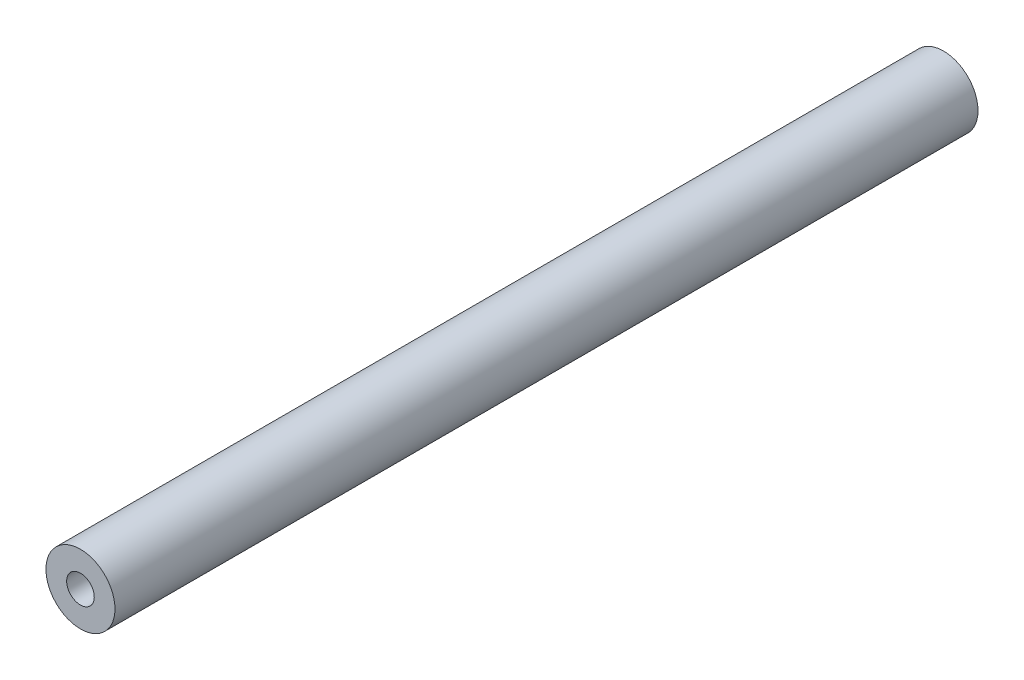
ISO-10303-21;
HEADER;
FILE_DESCRIPTION(('STEP AP214'),'2;1');
FILE_NAME('part.step','',(''),(''),'','','');
FILE_SCHEMA(('AUTOMOTIVE_DESIGN { 1 0 10303 214 1 1 1 1 }'));
ENDSEC;
DATA;
#1=APPLICATION_CONTEXT('core data for automotive mechanical design processes');
#2=APPLICATION_PROTOCOL_DEFINITION('international standard','automotive_design',2000,#1);
#3=PRODUCT_CONTEXT('',#1,'mechanical');
#4=PRODUCT('Part','Part','',(#3));
#5=PRODUCT_RELATED_PRODUCT_CATEGORY('part','',(#4));
#6=PRODUCT_DEFINITION_FORMATION('','',#4);
#7=PRODUCT_DEFINITION_CONTEXT('part definition',#1,'design');
#8=PRODUCT_DEFINITION('design','',#6,#7);
#9=PRODUCT_DEFINITION_SHAPE('','',#8);
#10=(LENGTH_UNIT() NAMED_UNIT(*) SI_UNIT(.MILLI.,.METRE.));
#11=(NAMED_UNIT(*) PLANE_ANGLE_UNIT() SI_UNIT($,.RADIAN.));
#12=(NAMED_UNIT(*) SI_UNIT($,.STERADIAN.) SOLID_ANGLE_UNIT());
#13=UNCERTAINTY_MEASURE_WITH_UNIT(LENGTH_MEASURE(1.E-05),#10,'distance_accuracy_value','');
#14=(GEOMETRIC_REPRESENTATION_CONTEXT(3) GLOBAL_UNCERTAINTY_ASSIGNED_CONTEXT((#13)) GLOBAL_UNIT_ASSIGNED_CONTEXT((#10,
#11,#12)) REPRESENTATION_CONTEXT('',''));
#15=CARTESIAN_POINT('',(0.,0.,0.));
#16=DIRECTION('',(0.,0.,1.));
#17=DIRECTION('',(1.,0.,0.));
#18=AXIS2_PLACEMENT_3D('',#15,#16,#17);
#19=CARTESIAN_POINT('',(0.,0.,100.));
#20=DIRECTION('',(0.,0.,1.));
#21=DIRECTION('',(1.,0.,0.));
#22=AXIS2_PLACEMENT_3D('',#19,#20,#21);
#23=PLANE('',#22);
#24=CARTESIAN_POINT('',(0.,0.,100.));
#25=DIRECTION('',(0.,0.,1.));
#26=DIRECTION('',(1.,0.,0.));
#27=AXIS2_PLACEMENT_3D('',#24,#25,#26);
#28=CIRCLE('',#27,4.);
#29=CARTESIAN_POINT('',(4.,0.,100.));
#30=VERTEX_POINT('',#29);
#31=EDGE_CURVE('E10',#30,#30,#28,.T.);
#32=ORIENTED_EDGE('',*,*,#31,.T.);
#33=EDGE_LOOP('',(#32));
#34=FACE_BOUND('',#33,.T.);
#35=CARTESIAN_POINT('',(0.,0.,100.));
#36=DIRECTION('',(0.,0.,1.));
#37=DIRECTION('',(1.,0.,0.));
#38=AXIS2_PLACEMENT_3D('',#35,#36,#37);
#39=CIRCLE('',#38,1.6);
#40=CARTESIAN_POINT('',(1.6,0.,100.));
#41=VERTEX_POINT('',#40);
#42=EDGE_CURVE('E56',#41,#41,#39,.T.);
#43=ORIENTED_EDGE('',*,*,#42,.F.);
#44=EDGE_LOOP('',(#43));
#45=FACE_BOUND('',#44,.T.);
#46=ADVANCED_FACE('F42',(#34,#45),#23,.T.);
#47=CARTESIAN_POINT('',(0.,0.,0.));
#48=DIRECTION('',(0.,0.,1.));
#49=DIRECTION('',(1.,0.,0.));
#50=AXIS2_PLACEMENT_3D('',#47,#48,#49);
#51=PLANE('',#50);
#52=CARTESIAN_POINT('',(0.,0.,0.));
#53=DIRECTION('',(0.,0.,1.));
#54=DIRECTION('',(1.,0.,0.));
#55=AXIS2_PLACEMENT_3D('',#52,#53,#54);
#56=CIRCLE('',#55,4.);
#57=CARTESIAN_POINT('',(4.,0.,0.));
#58=VERTEX_POINT('',#57);
#59=EDGE_CURVE('E46',#58,#58,#56,.T.);
#60=ORIENTED_EDGE('',*,*,#59,.F.);
#61=EDGE_LOOP('',(#60));
#62=FACE_BOUND('',#61,.T.);
#63=CARTESIAN_POINT('',(0.,0.,0.));
#64=DIRECTION('',(0.,0.,1.));
#65=DIRECTION('',(1.,0.,0.));
#66=AXIS2_PLACEMENT_3D('',#63,#64,#65);
#67=CIRCLE('',#66,1.6);
#68=CARTESIAN_POINT('',(1.6,0.,0.));
#69=VERTEX_POINT('',#68);
#70=EDGE_CURVE('E58',#69,#69,#67,.T.);
#71=ORIENTED_EDGE('',*,*,#70,.T.);
#72=EDGE_LOOP('',(#71));
#73=FACE_BOUND('',#72,.T.);
#74=ADVANCED_FACE('F69',(#62,#73),#51,.F.);
#75=CARTESIAN_POINT('',(0.,0.,100.));
#76=DIRECTION('',(0.,0.,-1.));
#77=DIRECTION('',(-1.,0.,0.));
#78=AXIS2_PLACEMENT_3D('',#75,#76,#77);
#79=CYLINDRICAL_SURFACE('',#78,4.);
#80=ORIENTED_EDGE('',*,*,#31,.F.);
#81=EDGE_LOOP('',(#80));
#82=FACE_BOUND('',#81,.T.);
#83=ORIENTED_EDGE('',*,*,#59,.T.);
#84=EDGE_LOOP('',(#83));
#85=FACE_BOUND('',#84,.T.);
#86=ADVANCED_FACE('F44',(#82,#85),#79,.T.);
#87=CARTESIAN_POINT('',(0.,0.,100.));
#88=DIRECTION('',(0.,0.,-1.));
#89=DIRECTION('',(-1.,0.,0.));
#90=AXIS2_PLACEMENT_3D('',#87,#88,#89);
#91=CYLINDRICAL_SURFACE('',#90,1.6);
#92=ORIENTED_EDGE('',*,*,#42,.T.);
#93=EDGE_LOOP('',(#92));
#94=FACE_BOUND('',#93,.T.);
#95=ORIENTED_EDGE('',*,*,#70,.F.);
#96=EDGE_LOOP('',(#95));
#97=FACE_BOUND('',#96,.T.);
#98=ADVANCED_FACE('F65',(#94,#97),#91,.F.);
#99=CLOSED_SHELL('',(#46,#74,#86,#98));
#100=MANIFOLD_SOLID_BREP('B2',#99);
#101=ADVANCED_BREP_SHAPE_REPRESENTATION('',(#18,#100),#14);
#102=SHAPE_DEFINITION_REPRESENTATION(#9,#101);
ENDSEC;
END-ISO-10303-21;
